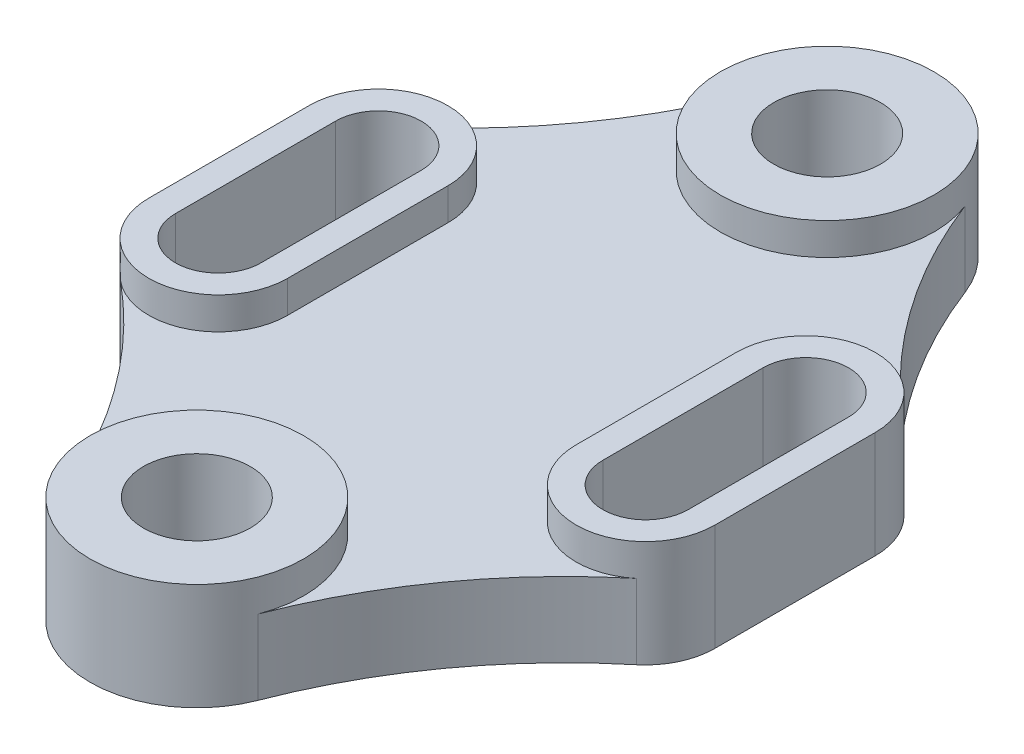
ISO-10303-21;
HEADER;
FILE_DESCRIPTION(('STEP AP214'),'2;1');
FILE_NAME('part.step','',(''),(''),'','','');
FILE_SCHEMA(('AUTOMOTIVE_DESIGN { 1 0 10303 214 1 1 1 1 }'));
ENDSEC;
DATA;
#1=APPLICATION_CONTEXT('core data for automotive mechanical design processes');
#2=APPLICATION_PROTOCOL_DEFINITION('international standard','automotive_design',2000,#1);
#3=PRODUCT_CONTEXT('',#1,'mechanical');
#4=PRODUCT('Part','Part','',(#3));
#5=PRODUCT_RELATED_PRODUCT_CATEGORY('part','',(#4));
#6=PRODUCT_DEFINITION_FORMATION('','',#4);
#7=PRODUCT_DEFINITION_CONTEXT('part definition',#1,'design');
#8=PRODUCT_DEFINITION('design','',#6,#7);
#9=PRODUCT_DEFINITION_SHAPE('','',#8);
#10=(LENGTH_UNIT() NAMED_UNIT(*) SI_UNIT(.MILLI.,.METRE.));
#11=(NAMED_UNIT(*) PLANE_ANGLE_UNIT() SI_UNIT($,.RADIAN.));
#12=(NAMED_UNIT(*) SI_UNIT($,.STERADIAN.) SOLID_ANGLE_UNIT());
#13=UNCERTAINTY_MEASURE_WITH_UNIT(LENGTH_MEASURE(1.E-05),#10,'distance_accuracy_value','');
#14=(GEOMETRIC_REPRESENTATION_CONTEXT(3) GLOBAL_UNCERTAINTY_ASSIGNED_CONTEXT((#13)) GLOBAL_UNIT_ASSIGNED_CONTEXT((#10,
#11,#12)) REPRESENTATION_CONTEXT('',''));
#15=CARTESIAN_POINT('',(0.,0.,0.));
#16=DIRECTION('',(0.,0.,1.));
#17=DIRECTION('',(1.,0.,0.));
#18=AXIS2_PLACEMENT_3D('',#15,#16,#17);
#19=CARTESIAN_POINT('',(-111.994027209244,14.,102.096842917494));
#20=DIRECTION('',(0.,-1.,0.));
#21=DIRECTION('',(0.,0.,-1.));
#22=AXIS2_PLACEMENT_3D('',#19,#20,#21);
#23=CYLINDRICAL_SURFACE('',#22,100.);
#24=CARTESIAN_POINT('',(-111.994027209244,0.,102.096842917494));
#25=DIRECTION('',(0.,1.,0.));
#26=DIRECTION('',(0.,0.,1.));
#27=AXIS2_PLACEMENT_3D('',#24,#25,#26);
#28=CIRCLE('',#27,100.);
#29=CARTESIAN_POINT('',(-18.6656712015406,0.,66.1828071529157));
#30=VERTEX_POINT('',#29);
#31=CARTESIAN_POINT('',(-48.2824987054882,0.,25.0199907781188));
#32=VERTEX_POINT('',#31);
#33=EDGE_CURVE('E179',#30,#32,#28,.T.);
#34=ORIENTED_EDGE('',*,*,#33,.F.);
#35=DIRECTION('',(0.,-1.,0.));
#36=VECTOR('',#35,1.);
#37=CARTESIAN_POINT('',(-18.6656712015406,14.,66.1828071529157));
#38=LINE('',#37,#36);
#39=CARTESIAN_POINT('',(-18.6656712015406,14.,66.1828071529157));
#40=VERTEX_POINT('',#39);
#41=EDGE_CURVE('E11',#40,#30,#38,.T.);
#42=ORIENTED_EDGE('',*,*,#41,.F.);
#43=CARTESIAN_POINT('',(-111.994027209244,14.,102.096842917494));
#44=DIRECTION('',(0.,1.,0.));
#45=DIRECTION('',(0.,0.,1.));
#46=AXIS2_PLACEMENT_3D('',#43,#44,#45);
#47=CIRCLE('',#46,100.);
#48=CARTESIAN_POINT('',(-48.2824987054882,14.,25.0199907781188));
#49=VERTEX_POINT('',#48);
#50=EDGE_CURVE('E104',#40,#49,#47,.T.);
#51=ORIENTED_EDGE('',*,*,#50,.T.);
#52=DIRECTION('',(0.,-1.,0.));
#53=VECTOR('',#52,1.);
#54=CARTESIAN_POINT('',(-48.2824987054882,14.,25.0199907781188));
#55=LINE('',#54,#53);
#56=EDGE_CURVE('E99',#49,#32,#55,.T.);
#57=ORIENTED_EDGE('',*,*,#56,.T.);
#58=EDGE_LOOP('',(#34,#42,#51,#57));
#59=FACE_BOUND('',#58,.T.);
#60=ADVANCED_FACE('F33',(#59),#23,.F.);
#61=CARTESIAN_POINT('',(111.994027209244,14.,102.096842917494));
#62=DIRECTION('',(0.,-1.,0.));
#63=DIRECTION('',(0.,0.,-1.));
#64=AXIS2_PLACEMENT_3D('',#61,#62,#63);
#65=CYLINDRICAL_SURFACE('',#64,100.);
#66=CARTESIAN_POINT('',(111.994027209244,0.,102.096842917494));
#67=DIRECTION('',(0.,1.,0.));
#68=DIRECTION('',(0.,0.,1.));
#69=AXIS2_PLACEMENT_3D('',#66,#67,#68);
#70=CIRCLE('',#69,100.);
#71=CARTESIAN_POINT('',(18.6656712015406,0.,66.1828071529157));
#72=VERTEX_POINT('',#71);
#73=CARTESIAN_POINT('',(48.2824987054882,0.,25.0199907781188));
#74=VERTEX_POINT('',#73);
#75=EDGE_CURVE('E109',#72,#74,#70,.F.);
#76=ORIENTED_EDGE('',*,*,#75,.T.);
#77=DIRECTION('',(0.,-1.,0.));
#78=VECTOR('',#77,1.);
#79=CARTESIAN_POINT('',(48.2824987054882,14.,25.0199907781188));
#80=LINE('',#79,#78);
#81=CARTESIAN_POINT('',(48.2824987054882,14.,25.0199907781188));
#82=VERTEX_POINT('',#81);
#83=EDGE_CURVE('E122',#82,#74,#80,.T.);
#84=ORIENTED_EDGE('',*,*,#83,.F.);
#85=CARTESIAN_POINT('',(111.994027209244,14.,102.096842917494));
#86=DIRECTION('',(0.,1.,0.));
#87=DIRECTION('',(0.,0.,1.));
#88=AXIS2_PLACEMENT_3D('',#85,#86,#87);
#89=CIRCLE('',#88,100.);
#90=CARTESIAN_POINT('',(18.6656712015406,14.,66.1828071529157));
#91=VERTEX_POINT('',#90);
#92=EDGE_CURVE('E133',#91,#82,#89,.F.);
#93=ORIENTED_EDGE('',*,*,#92,.F.);
#94=DIRECTION('',(0.,-1.,0.));
#95=VECTOR('',#94,1.);
#96=CARTESIAN_POINT('',(18.6656712015406,14.,66.1828071529157));
#97=LINE('',#96,#95);
#98=EDGE_CURVE('E41',#91,#72,#97,.T.);
#99=ORIENTED_EDGE('',*,*,#98,.T.);
#100=EDGE_LOOP('',(#76,#84,#93,#99));
#101=FACE_BOUND('',#100,.T.);
#102=ADVANCED_FACE('F129',(#101),#65,.F.);
#103=CARTESIAN_POINT('',(111.994027209244,14.,-102.096842917494));
#104=DIRECTION('',(0.,-1.,0.));
#105=DIRECTION('',(0.,0.,-1.));
#106=AXIS2_PLACEMENT_3D('',#103,#104,#105);
#107=CYLINDRICAL_SURFACE('',#106,100.);
#108=CARTESIAN_POINT('',(111.994027209244,0.,-102.096842917494));
#109=DIRECTION('',(0.,1.,0.));
#110=DIRECTION('',(0.,0.,1.));
#111=AXIS2_PLACEMENT_3D('',#108,#109,#110);
#112=CIRCLE('',#111,100.);
#113=CARTESIAN_POINT('',(18.6656712015406,0.,-66.1828071529157));
#114=VERTEX_POINT('',#113);
#115=CARTESIAN_POINT('',(48.2824987054882,0.,-25.0199907781188));
#116=VERTEX_POINT('',#115);
#117=EDGE_CURVE('E105',#114,#116,#112,.T.);
#118=ORIENTED_EDGE('',*,*,#117,.F.);
#119=DIRECTION('',(0.,-1.,0.));
#120=VECTOR('',#119,1.);
#121=CARTESIAN_POINT('',(18.6656712015406,14.,-66.1828071529157));
#122=LINE('',#121,#120);
#123=CARTESIAN_POINT('',(18.6656712015406,14.,-66.1828071529157));
#124=VERTEX_POINT('',#123);
#125=EDGE_CURVE('E117',#124,#114,#122,.T.);
#126=ORIENTED_EDGE('',*,*,#125,.F.);
#127=CARTESIAN_POINT('',(111.994027209244,14.,-102.096842917494));
#128=DIRECTION('',(0.,1.,0.));
#129=DIRECTION('',(0.,0.,1.));
#130=AXIS2_PLACEMENT_3D('',#127,#128,#129);
#131=CIRCLE('',#130,100.);
#132=CARTESIAN_POINT('',(48.2824987054882,14.,-25.0199907781188));
#133=VERTEX_POINT('',#132);
#134=EDGE_CURVE('E165',#124,#133,#131,.T.);
#135=ORIENTED_EDGE('',*,*,#134,.T.);
#136=DIRECTION('',(0.,-1.,0.));
#137=VECTOR('',#136,1.);
#138=CARTESIAN_POINT('',(48.2824987054882,14.,-25.0199907781188));
#139=LINE('',#138,#137);
#140=EDGE_CURVE('E119',#133,#116,#139,.T.);
#141=ORIENTED_EDGE('',*,*,#140,.T.);
#142=EDGE_LOOP('',(#118,#126,#135,#141));
#143=FACE_BOUND('',#142,.T.);
#144=ADVANCED_FACE('F345',(#143),#107,.F.);
#145=CARTESIAN_POINT('',(-111.994027209244,14.,-102.096842917494));
#146=DIRECTION('',(0.,-1.,0.));
#147=DIRECTION('',(0.,0.,-1.));
#148=AXIS2_PLACEMENT_3D('',#145,#146,#147);
#149=CYLINDRICAL_SURFACE('',#148,100.);
#150=CARTESIAN_POINT('',(-111.994027209244,0.,-102.096842917494));
#151=DIRECTION('',(0.,1.,0.));
#152=DIRECTION('',(0.,0.,1.));
#153=AXIS2_PLACEMENT_3D('',#150,#151,#152);
#154=CIRCLE('',#153,100.);
#155=CARTESIAN_POINT('',(-18.6656712015406,0.,-66.1828071529157));
#156=VERTEX_POINT('',#155);
#157=CARTESIAN_POINT('',(-48.2824987054882,0.,-25.0199907781188));
#158=VERTEX_POINT('',#157);
#159=EDGE_CURVE('E76',#156,#158,#154,.F.);
#160=ORIENTED_EDGE('',*,*,#159,.T.);
#161=DIRECTION('',(0.,-1.,0.));
#162=VECTOR('',#161,1.);
#163=CARTESIAN_POINT('',(-48.2824987054882,14.,-25.0199907781188));
#164=LINE('',#163,#162);
#165=CARTESIAN_POINT('',(-48.2824987054882,14.,-25.0199907781188));
#166=VERTEX_POINT('',#165);
#167=EDGE_CURVE('E89',#166,#158,#164,.T.);
#168=ORIENTED_EDGE('',*,*,#167,.F.);
#169=CARTESIAN_POINT('',(-111.994027209244,14.,-102.096842917494));
#170=DIRECTION('',(0.,1.,0.));
#171=DIRECTION('',(0.,0.,1.));
#172=AXIS2_PLACEMENT_3D('',#169,#170,#171);
#173=CIRCLE('',#172,100.);
#174=CARTESIAN_POINT('',(-18.6656712015406,14.,-66.1828071529157));
#175=VERTEX_POINT('',#174);
#176=EDGE_CURVE('E171',#175,#166,#173,.F.);
#177=ORIENTED_EDGE('',*,*,#176,.F.);
#178=DIRECTION('',(0.,-1.,0.));
#179=VECTOR('',#178,1.);
#180=CARTESIAN_POINT('',(-18.6656712015406,14.,-66.1828071529157));
#181=LINE('',#180,#179);
#182=EDGE_CURVE('E98',#175,#156,#181,.T.);
#183=ORIENTED_EDGE('',*,*,#182,.T.);
#184=EDGE_LOOP('',(#160,#168,#177,#183));
#185=FACE_BOUND('',#184,.T.);
#186=ADVANCED_FACE('F102',(#185),#149,.F.);
#187=CARTESIAN_POINT('',(0.,14.,0.));
#188=DIRECTION('',(0.,1.,0.));
#189=DIRECTION('',(0.,0.,1.));
#190=AXIS2_PLACEMENT_3D('',#187,#188,#189);
#191=PLANE('',#190);
#192=ORIENTED_EDGE('',*,*,#50,.F.);
#193=CARTESIAN_POINT('',(0.,14.,59.));
#194=DIRECTION('',(0.,1.,0.));
#195=DIRECTION('',(0.,0.,1.));
#196=AXIS2_PLACEMENT_3D('',#193,#194,#195);
#197=CIRCLE('',#196,20.);
#198=EDGE_CURVE('E49',#40,#91,#197,.F.);
#199=ORIENTED_EDGE('',*,*,#198,.T.);
#200=ORIENTED_EDGE('',*,*,#92,.T.);
#201=CARTESIAN_POINT('',(40.,14.,15.));
#202=DIRECTION('',(0.,1.,0.));
#203=DIRECTION('',(0.,0.,1.));
#204=AXIS2_PLACEMENT_3D('',#201,#202,#203);
#205=CIRCLE('',#204,13.);
#206=CARTESIAN_POINT('',(27.,14.,15.));
#207=VERTEX_POINT('',#206);
#208=EDGE_CURVE('E156',#207,#82,#205,.T.);
#209=ORIENTED_EDGE('',*,*,#208,.F.);
#210=DIRECTION('',(0.,0.,-1.));
#211=VECTOR('',#210,1.);
#212=CARTESIAN_POINT('',(27.,14.,0.));
#213=LINE('',#212,#211);
#214=CARTESIAN_POINT('',(27.,14.,-15.));
#215=VERTEX_POINT('',#214);
#216=EDGE_CURVE('E159',#207,#215,#213,.T.);
#217=ORIENTED_EDGE('',*,*,#216,.T.);
#218=CARTESIAN_POINT('',(40.,14.,-15.));
#219=DIRECTION('',(0.,1.,0.));
#220=DIRECTION('',(0.,0.,1.));
#221=AXIS2_PLACEMENT_3D('',#218,#219,#220);
#222=CIRCLE('',#221,13.);
#223=EDGE_CURVE('E162',#133,#215,#222,.T.);
#224=ORIENTED_EDGE('',*,*,#223,.F.);
#225=ORIENTED_EDGE('',*,*,#134,.F.);
#226=CARTESIAN_POINT('',(0.,14.,-59.));
#227=DIRECTION('',(0.,1.,0.));
#228=DIRECTION('',(0.,0.,1.));
#229=AXIS2_PLACEMENT_3D('',#226,#227,#228);
#230=CIRCLE('',#229,20.);
#231=EDGE_CURVE('E168',#175,#124,#230,.T.);
#232=ORIENTED_EDGE('',*,*,#231,.F.);
#233=ORIENTED_EDGE('',*,*,#176,.T.);
#234=CARTESIAN_POINT('',(-40.,14.,-15.));
#235=DIRECTION('',(0.,1.,0.));
#236=DIRECTION('',(0.,0.,1.));
#237=AXIS2_PLACEMENT_3D('',#234,#235,#236);
#238=CIRCLE('',#237,13.);
#239=CARTESIAN_POINT('',(-27.,14.,-15.));
#240=VERTEX_POINT('',#239);
#241=EDGE_CURVE('E94',#240,#166,#238,.T.);
#242=ORIENTED_EDGE('',*,*,#241,.F.);
#243=DIRECTION('',(0.,0.,-1.));
#244=VECTOR('',#243,1.);
#245=CARTESIAN_POINT('',(-27.,14.,0.));
#246=LINE('',#245,#244);
#247=CARTESIAN_POINT('',(-27.,14.,15.));
#248=VERTEX_POINT('',#247);
#249=EDGE_CURVE('E174',#248,#240,#246,.T.);
#250=ORIENTED_EDGE('',*,*,#249,.F.);
#251=CARTESIAN_POINT('',(-40.,14.,15.));
#252=DIRECTION('',(0.,1.,0.));
#253=DIRECTION('',(0.,0.,1.));
#254=AXIS2_PLACEMENT_3D('',#251,#252,#253);
#255=CIRCLE('',#254,13.);
#256=EDGE_CURVE('E114',#49,#248,#255,.T.);
#257=ORIENTED_EDGE('',*,*,#256,.F.);
#258=EDGE_LOOP('',(#192,#199,#200,#209,#217,#224,#225,#232,#233,#242,#250,#257));
#259=FACE_BOUND('',#258,.T.);
#260=ADVANCED_FACE('F348',(#259),#191,.T.);
#261=CARTESIAN_POINT('',(0.,0.,0.));
#262=DIRECTION('',(0.,1.,0.));
#263=DIRECTION('',(0.,0.,1.));
#264=AXIS2_PLACEMENT_3D('',#261,#262,#263);
#265=PLANE('',#264);
#266=CARTESIAN_POINT('',(40.,0.,15.));
#267=DIRECTION('',(0.,1.,0.));
#268=DIRECTION('',(0.,0.,1.));
#269=AXIS2_PLACEMENT_3D('',#266,#267,#268);
#270=CIRCLE('',#269,13.);
#271=CARTESIAN_POINT('',(53.,0.,15.));
#272=VERTEX_POINT('',#271);
#273=EDGE_CURVE('E275',#74,#272,#270,.T.);
#274=ORIENTED_EDGE('',*,*,#273,.F.);
#275=ORIENTED_EDGE('',*,*,#75,.F.);
#276=CARTESIAN_POINT('',(0.,0.,59.));
#277=DIRECTION('',(0.,1.,0.));
#278=DIRECTION('',(0.,0.,1.));
#279=AXIS2_PLACEMENT_3D('',#276,#277,#278);
#280=CIRCLE('',#279,20.);
#281=EDGE_CURVE('E137',#72,#30,#280,.F.);
#282=ORIENTED_EDGE('',*,*,#281,.T.);
#283=ORIENTED_EDGE('',*,*,#33,.T.);
#284=CARTESIAN_POINT('',(-40.,0.,15.));
#285=DIRECTION('',(0.,1.,0.));
#286=DIRECTION('',(0.,0.,1.));
#287=AXIS2_PLACEMENT_3D('',#284,#285,#286);
#288=CIRCLE('',#287,13.);
#289=CARTESIAN_POINT('',(-53.,0.,15.));
#290=VERTEX_POINT('',#289);
#291=EDGE_CURVE('E85',#290,#32,#288,.T.);
#292=ORIENTED_EDGE('',*,*,#291,.F.);
#293=DIRECTION('',(0.,0.,-1.));
#294=VECTOR('',#293,1.);
#295=CARTESIAN_POINT('',(-53.,0.,0.));
#296=LINE('',#295,#294);
#297=CARTESIAN_POINT('',(-53.,0.,-15.));
#298=VERTEX_POINT('',#297);
#299=EDGE_CURVE('E80',#290,#298,#296,.T.);
#300=ORIENTED_EDGE('',*,*,#299,.T.);
#301=CARTESIAN_POINT('',(-40.,0.,-15.));
#302=DIRECTION('',(0.,1.,0.));
#303=DIRECTION('',(0.,0.,1.));
#304=AXIS2_PLACEMENT_3D('',#301,#302,#303);
#305=CIRCLE('',#304,13.);
#306=EDGE_CURVE('E69',#158,#298,#305,.T.);
#307=ORIENTED_EDGE('',*,*,#306,.F.);
#308=ORIENTED_EDGE('',*,*,#159,.F.);
#309=CARTESIAN_POINT('',(0.,0.,-59.));
#310=DIRECTION('',(0.,1.,0.));
#311=DIRECTION('',(0.,0.,1.));
#312=AXIS2_PLACEMENT_3D('',#309,#310,#311);
#313=CIRCLE('',#312,20.);
#314=EDGE_CURVE('E64',#114,#156,#313,.T.);
#315=ORIENTED_EDGE('',*,*,#314,.F.);
#316=ORIENTED_EDGE('',*,*,#117,.T.);
#317=CARTESIAN_POINT('',(40.,0.,-15.));
#318=DIRECTION('',(0.,1.,0.));
#319=DIRECTION('',(0.,0.,1.));
#320=AXIS2_PLACEMENT_3D('',#317,#318,#319);
#321=CIRCLE('',#320,13.);
#322=CARTESIAN_POINT('',(53.,0.,-15.));
#323=VERTEX_POINT('',#322);
#324=EDGE_CURVE('E268',#323,#116,#321,.T.);
#325=ORIENTED_EDGE('',*,*,#324,.F.);
#326=DIRECTION('',(0.,0.,-1.));
#327=VECTOR('',#326,1.);
#328=CARTESIAN_POINT('',(53.,0.,0.));
#329=LINE('',#328,#327);
#330=EDGE_CURVE('E272',#272,#323,#329,.T.);
#331=ORIENTED_EDGE('',*,*,#330,.F.);
#332=EDGE_LOOP('',(#274,#275,#282,#283,#292,#300,#307,#308,#315,#316,#325,#331));
#333=FACE_BOUND('',#332,.T.);
#334=CARTESIAN_POINT('',(0.,0.,59.));
#335=DIRECTION('',(0.,1.,0.));
#336=DIRECTION('',(0.,0.,1.));
#337=AXIS2_PLACEMENT_3D('',#334,#335,#336);
#338=CIRCLE('',#337,10.);
#339=CARTESIAN_POINT('',(0.,0.,69.));
#340=VERTEX_POINT('',#339);
#341=EDGE_CURVE('E141',#340,#340,#338,.F.);
#342=ORIENTED_EDGE('',*,*,#341,.F.);
#343=EDGE_LOOP('',(#342));
#344=FACE_BOUND('',#343,.T.);
#345=CARTESIAN_POINT('',(-40.,0.,-15.));
#346=DIRECTION('',(0.,1.,0.));
#347=DIRECTION('',(0.,0.,1.));
#348=AXIS2_PLACEMENT_3D('',#345,#346,#347);
#349=CIRCLE('',#348,7.99999999999999);
#350=CARTESIAN_POINT('',(-32.,0.,-15.));
#351=VERTEX_POINT('',#350);
#352=CARTESIAN_POINT('',(-48.,0.,-15.));
#353=VERTEX_POINT('',#352);
#354=EDGE_CURVE('E218',#351,#353,#349,.T.);
#355=ORIENTED_EDGE('',*,*,#354,.T.);
#356=DIRECTION('',(0.,0.,-1.));
#357=VECTOR('',#356,1.);
#358=CARTESIAN_POINT('',(-48.,0.,0.));
#359=LINE('',#358,#357);
#360=CARTESIAN_POINT('',(-48.,0.,15.));
#361=VERTEX_POINT('',#360);
#362=EDGE_CURVE('E209',#361,#353,#359,.T.);
#363=ORIENTED_EDGE('',*,*,#362,.F.);
#364=CARTESIAN_POINT('',(-40.,0.,15.));
#365=DIRECTION('',(0.,1.,0.));
#366=DIRECTION('',(0.,0.,1.));
#367=AXIS2_PLACEMENT_3D('',#364,#365,#366);
#368=CIRCLE('',#367,7.99999999999999);
#369=CARTESIAN_POINT('',(-32.,0.,15.));
#370=VERTEX_POINT('',#369);
#371=EDGE_CURVE('E212',#361,#370,#368,.T.);
#372=ORIENTED_EDGE('',*,*,#371,.T.);
#373=DIRECTION('',(0.,0.,-1.));
#374=VECTOR('',#373,1.);
#375=CARTESIAN_POINT('',(-32.,0.,0.));
#376=LINE('',#375,#374);
#377=EDGE_CURVE('E215',#370,#351,#376,.T.);
#378=ORIENTED_EDGE('',*,*,#377,.T.);
#379=EDGE_LOOP('',(#355,#363,#372,#378));
#380=FACE_BOUND('',#379,.T.);
#381=CARTESIAN_POINT('',(40.,0.,-15.));
#382=DIRECTION('',(0.,1.,0.));
#383=DIRECTION('',(0.,0.,1.));
#384=AXIS2_PLACEMENT_3D('',#381,#382,#383);
#385=CIRCLE('',#384,8.);
#386=CARTESIAN_POINT('',(48.,0.,-15.));
#387=VERTEX_POINT('',#386);
#388=CARTESIAN_POINT('',(32.,0.,-15.));
#389=VERTEX_POINT('',#388);
#390=EDGE_CURVE('E287',#387,#389,#385,.T.);
#391=ORIENTED_EDGE('',*,*,#390,.T.);
#392=DIRECTION('',(0.,0.,-1.));
#393=VECTOR('',#392,1.);
#394=CARTESIAN_POINT('',(32.,0.,0.));
#395=LINE('',#394,#393);
#396=CARTESIAN_POINT('',(32.,0.,15.));
#397=VERTEX_POINT('',#396);
#398=EDGE_CURVE('E278',#397,#389,#395,.T.);
#399=ORIENTED_EDGE('',*,*,#398,.F.);
#400=CARTESIAN_POINT('',(40.,0.,15.));
#401=DIRECTION('',(0.,1.,0.));
#402=DIRECTION('',(0.,0.,1.));
#403=AXIS2_PLACEMENT_3D('',#400,#401,#402);
#404=CIRCLE('',#403,8.);
#405=CARTESIAN_POINT('',(48.,0.,15.));
#406=VERTEX_POINT('',#405);
#407=EDGE_CURVE('E281',#397,#406,#404,.T.);
#408=ORIENTED_EDGE('',*,*,#407,.T.);
#409=DIRECTION('',(0.,0.,-1.));
#410=VECTOR('',#409,1.);
#411=CARTESIAN_POINT('',(48.,0.,0.));
#412=LINE('',#411,#410);
#413=EDGE_CURVE('E284',#406,#387,#412,.T.);
#414=ORIENTED_EDGE('',*,*,#413,.T.);
#415=EDGE_LOOP('',(#391,#399,#408,#414));
#416=FACE_BOUND('',#415,.T.);
#417=CARTESIAN_POINT('',(0.,0.,-59.));
#418=DIRECTION('',(0.,1.,0.));
#419=DIRECTION('',(0.,0.,1.));
#420=AXIS2_PLACEMENT_3D('',#417,#418,#419);
#421=CIRCLE('',#420,10.);
#422=CARTESIAN_POINT('',(0.,0.,-49.));
#423=VERTEX_POINT('',#422);
#424=EDGE_CURVE('E315',#423,#423,#421,.T.);
#425=ORIENTED_EDGE('',*,*,#424,.T.);
#426=EDGE_LOOP('',(#425));
#427=FACE_BOUND('',#426,.T.);
#428=ADVANCED_FACE('F72',(#333,#344,#380,#416,#427),#265,.F.);
#429=CARTESIAN_POINT('',(0.,20.,59.));
#430=DIRECTION('',(0.,-1.,0.));
#431=DIRECTION('',(0.,0.,-1.));
#432=AXIS2_PLACEMENT_3D('',#429,#430,#431);
#433=CYLINDRICAL_SURFACE('',#432,20.);
#434=ORIENTED_EDGE('',*,*,#198,.F.);
#435=ORIENTED_EDGE('',*,*,#41,.T.);
#436=ORIENTED_EDGE('',*,*,#281,.F.);
#437=ORIENTED_EDGE('',*,*,#98,.F.);
#438=EDGE_LOOP('',(#434,#435,#436,#437));
#439=FACE_BOUND('',#438,.T.);
#440=CARTESIAN_POINT('',(0.,20.,59.));
#441=DIRECTION('',(0.,1.,0.));
#442=DIRECTION('',(0.,0.,1.));
#443=AXIS2_PLACEMENT_3D('',#440,#441,#442);
#444=CIRCLE('',#443,20.);
#445=CARTESIAN_POINT('',(0.,20.,79.));
#446=VERTEX_POINT('',#445);
#447=EDGE_CURVE('E145',#446,#446,#444,.F.);
#448=ORIENTED_EDGE('',*,*,#447,.T.);
#449=EDGE_LOOP('',(#448));
#450=FACE_BOUND('',#449,.T.);
#451=ADVANCED_FACE('F138',(#439,#450),#433,.T.);
#452=CARTESIAN_POINT('',(0.,20.,59.));
#453=DIRECTION('',(0.,-1.,0.));
#454=DIRECTION('',(0.,0.,-1.));
#455=AXIS2_PLACEMENT_3D('',#452,#453,#454);
#456=CYLINDRICAL_SURFACE('',#455,10.);
#457=CARTESIAN_POINT('',(0.,20.,59.));
#458=DIRECTION('',(0.,1.,0.));
#459=DIRECTION('',(0.,0.,1.));
#460=AXIS2_PLACEMENT_3D('',#457,#458,#459);
#461=CIRCLE('',#460,10.);
#462=CARTESIAN_POINT('',(0.,20.,69.));
#463=VERTEX_POINT('',#462);
#464=EDGE_CURVE('E151',#463,#463,#461,.F.);
#465=ORIENTED_EDGE('',*,*,#464,.F.);
#466=EDGE_LOOP('',(#465));
#467=FACE_BOUND('',#466,.T.);
#468=ORIENTED_EDGE('',*,*,#341,.T.);
#469=EDGE_LOOP('',(#468));
#470=FACE_BOUND('',#469,.T.);
#471=ADVANCED_FACE('F483',(#467,#470),#456,.F.);
#472=CARTESIAN_POINT('',(0.,20.,0.));
#473=DIRECTION('',(0.,1.,0.));
#474=DIRECTION('',(0.,0.,1.));
#475=AXIS2_PLACEMENT_3D('',#472,#473,#474);
#476=PLANE('',#475);
#477=ORIENTED_EDGE('',*,*,#447,.F.);
#478=EDGE_LOOP('',(#477));
#479=FACE_BOUND('',#478,.T.);
#480=ORIENTED_EDGE('',*,*,#464,.T.);
#481=EDGE_LOOP('',(#480));
#482=FACE_BOUND('',#481,.T.);
#483=ADVANCED_FACE('F463',(#479,#482),#476,.T.);
#484=CARTESIAN_POINT('',(-40.,20.,-15.));
#485=DIRECTION('',(0.,-1.,0.));
#486=DIRECTION('',(0.,0.,-1.));
#487=AXIS2_PLACEMENT_3D('',#484,#485,#486);
#488=CYLINDRICAL_SURFACE('',#487,13.);
#489=ORIENTED_EDGE('',*,*,#241,.T.);
#490=ORIENTED_EDGE('',*,*,#167,.T.);
#491=ORIENTED_EDGE('',*,*,#306,.T.);
#492=DIRECTION('',(0.,-1.,0.));
#493=VECTOR('',#492,1.);
#494=CARTESIAN_POINT('',(-53.,20.,-15.));
#495=LINE('',#494,#493);
#496=CARTESIAN_POINT('',(-53.,20.,-15.));
#497=VERTEX_POINT('',#496);
#498=EDGE_CURVE('E190',#497,#298,#495,.T.);
#499=ORIENTED_EDGE('',*,*,#498,.F.);
#500=CARTESIAN_POINT('',(-40.,20.,-15.));
#501=DIRECTION('',(0.,1.,0.));
#502=DIRECTION('',(0.,0.,1.));
#503=AXIS2_PLACEMENT_3D('',#500,#501,#502);
#504=CIRCLE('',#503,13.);
#505=CARTESIAN_POINT('',(-27.,20.,-15.));
#506=VERTEX_POINT('',#505);
#507=EDGE_CURVE('E199',#506,#497,#504,.T.);
#508=ORIENTED_EDGE('',*,*,#507,.F.);
#509=DIRECTION('',(0.,-1.,0.));
#510=VECTOR('',#509,1.);
#511=CARTESIAN_POINT('',(-27.,20.,-15.));
#512=LINE('',#511,#510);
#513=EDGE_CURVE('E203',#506,#240,#512,.T.);
#514=ORIENTED_EDGE('',*,*,#513,.T.);
#515=EDGE_LOOP('',(#489,#490,#491,#499,#508,#514));
#516=FACE_BOUND('',#515,.T.);
#517=ADVANCED_FACE('F90',(#516),#488,.T.);
#518=CARTESIAN_POINT('',(-53.,20.,0.));
#519=DIRECTION('',(-1.,0.,0.));
#520=DIRECTION('',(0.,0.,1.));
#521=AXIS2_PLACEMENT_3D('',#518,#519,#520);
#522=PLANE('',#521);
#523=ORIENTED_EDGE('',*,*,#299,.F.);
#524=DIRECTION('',(0.,-1.,0.));
#525=VECTOR('',#524,1.);
#526=CARTESIAN_POINT('',(-53.,20.,15.));
#527=LINE('',#526,#525);
#528=CARTESIAN_POINT('',(-53.,20.,15.));
#529=VERTEX_POINT('',#528);
#530=EDGE_CURVE('E142',#529,#290,#527,.T.);
#531=ORIENTED_EDGE('',*,*,#530,.F.);
#532=DIRECTION('',(0.,0.,-1.));
#533=VECTOR('',#532,1.);
#534=CARTESIAN_POINT('',(-53.,20.,0.));
#535=LINE('',#534,#533);
#536=EDGE_CURVE('E230',#529,#497,#535,.T.);
#537=ORIENTED_EDGE('',*,*,#536,.T.);
#538=ORIENTED_EDGE('',*,*,#498,.T.);
#539=EDGE_LOOP('',(#523,#531,#537,#538));
#540=FACE_BOUND('',#539,.T.);
#541=ADVANCED_FACE('F455',(#540),#522,.T.);
#542=CARTESIAN_POINT('',(-40.,20.,15.));
#543=DIRECTION('',(0.,-1.,0.));
#544=DIRECTION('',(0.,0.,-1.));
#545=AXIS2_PLACEMENT_3D('',#542,#543,#544);
#546=CYLINDRICAL_SURFACE('',#545,13.);
#547=ORIENTED_EDGE('',*,*,#56,.F.);
#548=ORIENTED_EDGE('',*,*,#256,.T.);
#549=DIRECTION('',(0.,-1.,0.));
#550=VECTOR('',#549,1.);
#551=CARTESIAN_POINT('',(-27.,20.,15.));
#552=LINE('',#551,#550);
#553=CARTESIAN_POINT('',(-27.,20.,15.));
#554=VERTEX_POINT('',#553);
#555=EDGE_CURVE('E148',#554,#248,#552,.T.);
#556=ORIENTED_EDGE('',*,*,#555,.F.);
#557=CARTESIAN_POINT('',(-40.,20.,15.));
#558=DIRECTION('',(0.,1.,0.));
#559=DIRECTION('',(0.,0.,1.));
#560=AXIS2_PLACEMENT_3D('',#557,#558,#559);
#561=CIRCLE('',#560,13.);
#562=EDGE_CURVE('E227',#529,#554,#561,.T.);
#563=ORIENTED_EDGE('',*,*,#562,.F.);
#564=ORIENTED_EDGE('',*,*,#530,.T.);
#565=ORIENTED_EDGE('',*,*,#291,.T.);
#566=EDGE_LOOP('',(#547,#548,#556,#563,#564,#565));
#567=FACE_BOUND('',#566,.T.);
#568=ADVANCED_FACE('F442',(#567),#546,.T.);
#569=CARTESIAN_POINT('',(-27.,20.,0.));
#570=DIRECTION('',(-1.,0.,0.));
#571=DIRECTION('',(0.,0.,1.));
#572=AXIS2_PLACEMENT_3D('',#569,#570,#571);
#573=PLANE('',#572);
#574=ORIENTED_EDGE('',*,*,#249,.T.);
#575=ORIENTED_EDGE('',*,*,#513,.F.);
#576=DIRECTION('',(0.,0.,-1.));
#577=VECTOR('',#576,1.);
#578=CARTESIAN_POINT('',(-27.,20.,0.));
#579=LINE('',#578,#577);
#580=EDGE_CURVE('E224',#554,#506,#579,.T.);
#581=ORIENTED_EDGE('',*,*,#580,.F.);
#582=ORIENTED_EDGE('',*,*,#555,.T.);
#583=EDGE_LOOP('',(#574,#575,#581,#582));
#584=FACE_BOUND('',#583,.T.);
#585=ADVANCED_FACE('F449',(#584),#573,.F.);
#586=CARTESIAN_POINT('',(-40.,20.,-15.));
#587=DIRECTION('',(0.,-1.,0.));
#588=DIRECTION('',(0.,0.,-1.));
#589=AXIS2_PLACEMENT_3D('',#586,#587,#588);
#590=CYLINDRICAL_SURFACE('',#589,7.99999999999999);
#591=ORIENTED_EDGE('',*,*,#354,.F.);
#592=DIRECTION('',(0.,-1.,0.));
#593=VECTOR('',#592,1.);
#594=CARTESIAN_POINT('',(-32.,20.,-15.));
#595=LINE('',#594,#593);
#596=CARTESIAN_POINT('',(-32.,20.,-15.));
#597=VERTEX_POINT('',#596);
#598=EDGE_CURVE('E187',#597,#351,#595,.T.);
#599=ORIENTED_EDGE('',*,*,#598,.F.);
#600=CARTESIAN_POINT('',(-40.,20.,-15.));
#601=DIRECTION('',(0.,1.,0.));
#602=DIRECTION('',(0.,0.,1.));
#603=AXIS2_PLACEMENT_3D('',#600,#601,#602);
#604=CIRCLE('',#603,7.99999999999999);
#605=CARTESIAN_POINT('',(-48.,20.,-15.));
#606=VERTEX_POINT('',#605);
#607=EDGE_CURVE('E84',#597,#606,#604,.T.);
#608=ORIENTED_EDGE('',*,*,#607,.T.);
#609=DIRECTION('',(0.,-1.,0.));
#610=VECTOR('',#609,1.);
#611=CARTESIAN_POINT('',(-48.,20.,-15.));
#612=LINE('',#611,#610);
#613=EDGE_CURVE('E197',#606,#353,#612,.T.);
#614=ORIENTED_EDGE('',*,*,#613,.T.);
#615=EDGE_LOOP('',(#591,#599,#608,#614));
#616=FACE_BOUND('',#615,.T.);
#617=ADVANCED_FACE('F490',(#616),#590,.F.);
#618=CARTESIAN_POINT('',(-32.,20.,0.));
#619=DIRECTION('',(-1.,0.,0.));
#620=DIRECTION('',(0.,0.,1.));
#621=AXIS2_PLACEMENT_3D('',#618,#619,#620);
#622=PLANE('',#621);
#623=ORIENTED_EDGE('',*,*,#377,.F.);
#624=DIRECTION('',(0.,-1.,0.));
#625=VECTOR('',#624,1.);
#626=CARTESIAN_POINT('',(-32.,20.,15.));
#627=LINE('',#626,#625);
#628=CARTESIAN_POINT('',(-32.,20.,15.));
#629=VERTEX_POINT('',#628);
#630=EDGE_CURVE('E191',#629,#370,#627,.T.);
#631=ORIENTED_EDGE('',*,*,#630,.F.);
#632=DIRECTION('',(0.,0.,-1.));
#633=VECTOR('',#632,1.);
#634=CARTESIAN_POINT('',(-32.,20.,0.));
#635=LINE('',#634,#633);
#636=EDGE_CURVE('E239',#629,#597,#635,.T.);
#637=ORIENTED_EDGE('',*,*,#636,.T.);
#638=ORIENTED_EDGE('',*,*,#598,.T.);
#639=EDGE_LOOP('',(#623,#631,#637,#638));
#640=FACE_BOUND('',#639,.T.);
#641=ADVANCED_FACE('F493',(#640),#622,.T.);
#642=CARTESIAN_POINT('',(-40.,20.,15.));
#643=DIRECTION('',(0.,-1.,0.));
#644=DIRECTION('',(0.,0.,-1.));
#645=AXIS2_PLACEMENT_3D('',#642,#643,#644);
#646=CYLINDRICAL_SURFACE('',#645,7.99999999999999);
#647=ORIENTED_EDGE('',*,*,#371,.F.);
#648=DIRECTION('',(0.,-1.,0.));
#649=VECTOR('',#648,1.);
#650=CARTESIAN_POINT('',(-48.,20.,15.));
#651=LINE('',#650,#649);
#652=CARTESIAN_POINT('',(-48.,20.,15.));
#653=VERTEX_POINT('',#652);
#654=EDGE_CURVE('E194',#653,#361,#651,.T.);
#655=ORIENTED_EDGE('',*,*,#654,.F.);
#656=CARTESIAN_POINT('',(-40.,20.,15.));
#657=DIRECTION('',(0.,1.,0.));
#658=DIRECTION('',(0.,0.,1.));
#659=AXIS2_PLACEMENT_3D('',#656,#657,#658);
#660=CIRCLE('',#659,7.99999999999999);
#661=EDGE_CURVE('E236',#653,#629,#660,.T.);
#662=ORIENTED_EDGE('',*,*,#661,.T.);
#663=ORIENTED_EDGE('',*,*,#630,.T.);
#664=EDGE_LOOP('',(#647,#655,#662,#663));
#665=FACE_BOUND('',#664,.T.);
#666=ADVANCED_FACE('F497',(#665),#646,.F.);
#667=CARTESIAN_POINT('',(-48.,20.,0.));
#668=DIRECTION('',(-1.,0.,0.));
#669=DIRECTION('',(0.,0.,1.));
#670=AXIS2_PLACEMENT_3D('',#667,#668,#669);
#671=PLANE('',#670);
#672=ORIENTED_EDGE('',*,*,#362,.T.);
#673=ORIENTED_EDGE('',*,*,#613,.F.);
#674=DIRECTION('',(0.,0.,-1.));
#675=VECTOR('',#674,1.);
#676=CARTESIAN_POINT('',(-48.,20.,0.));
#677=LINE('',#676,#675);
#678=EDGE_CURVE('E233',#653,#606,#677,.T.);
#679=ORIENTED_EDGE('',*,*,#678,.F.);
#680=ORIENTED_EDGE('',*,*,#654,.T.);
#681=EDGE_LOOP('',(#672,#673,#679,#680));
#682=FACE_BOUND('',#681,.T.);
#683=ADVANCED_FACE('F500',(#682),#671,.F.);
#684=CARTESIAN_POINT('',(0.,20.,0.));
#685=DIRECTION('',(0.,1.,0.));
#686=DIRECTION('',(0.,0.,1.));
#687=AXIS2_PLACEMENT_3D('',#684,#685,#686);
#688=PLANE('',#687);
#689=ORIENTED_EDGE('',*,*,#607,.F.);
#690=ORIENTED_EDGE('',*,*,#636,.F.);
#691=ORIENTED_EDGE('',*,*,#661,.F.);
#692=ORIENTED_EDGE('',*,*,#678,.T.);
#693=EDGE_LOOP('',(#689,#690,#691,#692));
#694=FACE_BOUND('',#693,.T.);
#695=ORIENTED_EDGE('',*,*,#536,.F.);
#696=ORIENTED_EDGE('',*,*,#562,.T.);
#697=ORIENTED_EDGE('',*,*,#580,.T.);
#698=ORIENTED_EDGE('',*,*,#507,.T.);
#699=EDGE_LOOP('',(#695,#696,#697,#698));
#700=FACE_BOUND('',#699,.T.);
#701=ADVANCED_FACE('F452',(#694,#700),#688,.T.);
#702=CARTESIAN_POINT('',(40.,20.,15.));
#703=DIRECTION('',(0.,-1.,0.));
#704=DIRECTION('',(0.,0.,-1.));
#705=AXIS2_PLACEMENT_3D('',#702,#703,#704);
#706=CYLINDRICAL_SURFACE('',#705,13.);
#707=ORIENTED_EDGE('',*,*,#208,.T.);
#708=ORIENTED_EDGE('',*,*,#83,.T.);
#709=ORIENTED_EDGE('',*,*,#273,.T.);
#710=DIRECTION('',(0.,-1.,0.));
#711=VECTOR('',#710,1.);
#712=CARTESIAN_POINT('',(53.,20.,15.));
#713=LINE('',#712,#711);
#714=CARTESIAN_POINT('',(53.,20.,15.));
#715=VERTEX_POINT('',#714);
#716=EDGE_CURVE('E260',#715,#272,#713,.T.);
#717=ORIENTED_EDGE('',*,*,#716,.F.);
#718=CARTESIAN_POINT('',(40.,20.,15.));
#719=DIRECTION('',(0.,1.,0.));
#720=DIRECTION('',(0.,0.,1.));
#721=AXIS2_PLACEMENT_3D('',#718,#719,#720);
#722=CIRCLE('',#721,13.);
#723=CARTESIAN_POINT('',(27.,20.,15.));
#724=VERTEX_POINT('',#723);
#725=EDGE_CURVE('E296',#724,#715,#722,.T.);
#726=ORIENTED_EDGE('',*,*,#725,.F.);
#727=DIRECTION('',(0.,-1.,0.));
#728=VECTOR('',#727,1.);
#729=CARTESIAN_POINT('',(27.,20.,15.));
#730=LINE('',#729,#728);
#731=EDGE_CURVE('E221',#724,#207,#730,.T.);
#732=ORIENTED_EDGE('',*,*,#731,.T.);
#733=EDGE_LOOP('',(#707,#708,#709,#717,#726,#732));
#734=FACE_BOUND('',#733,.T.);
#735=ADVANCED_FACE('F507',(#734),#706,.T.);
#736=CARTESIAN_POINT('',(27.,20.,0.));
#737=DIRECTION('',(-1.,0.,0.));
#738=DIRECTION('',(0.,0.,1.));
#739=AXIS2_PLACEMENT_3D('',#736,#737,#738);
#740=PLANE('',#739);
#741=DIRECTION('',(0.,-1.,0.));
#742=VECTOR('',#741,1.);
#743=CARTESIAN_POINT('',(27.,20.,-15.));
#744=LINE('',#743,#742);
#745=CARTESIAN_POINT('',(27.,20.,-15.));
#746=VERTEX_POINT('',#745);
#747=EDGE_CURVE('E247',#746,#215,#744,.T.);
#748=ORIENTED_EDGE('',*,*,#747,.T.);
#749=ORIENTED_EDGE('',*,*,#216,.F.);
#750=ORIENTED_EDGE('',*,*,#731,.F.);
#751=DIRECTION('',(0.,0.,-1.));
#752=VECTOR('',#751,1.);
#753=CARTESIAN_POINT('',(27.,20.,0.));
#754=LINE('',#753,#752);
#755=EDGE_CURVE('E299',#724,#746,#754,.T.);
#756=ORIENTED_EDGE('',*,*,#755,.T.);
#757=EDGE_LOOP('',(#748,#749,#750,#756));
#758=FACE_BOUND('',#757,.T.);
#759=ADVANCED_FACE('F362',(#758),#740,.T.);
#760=CARTESIAN_POINT('',(53.,20.,0.));
#761=DIRECTION('',(-1.,0.,0.));
#762=DIRECTION('',(0.,0.,1.));
#763=AXIS2_PLACEMENT_3D('',#760,#761,#762);
#764=PLANE('',#763);
#765=ORIENTED_EDGE('',*,*,#330,.T.);
#766=DIRECTION('',(0.,-1.,0.));
#767=VECTOR('',#766,1.);
#768=CARTESIAN_POINT('',(53.,20.,-15.));
#769=LINE('',#768,#767);
#770=CARTESIAN_POINT('',(53.,20.,-15.));
#771=VERTEX_POINT('',#770);
#772=EDGE_CURVE('E263',#771,#323,#769,.T.);
#773=ORIENTED_EDGE('',*,*,#772,.F.);
#774=DIRECTION('',(0.,0.,-1.));
#775=VECTOR('',#774,1.);
#776=CARTESIAN_POINT('',(53.,20.,0.));
#777=LINE('',#776,#775);
#778=EDGE_CURVE('E293',#715,#771,#777,.T.);
#779=ORIENTED_EDGE('',*,*,#778,.F.);
#780=ORIENTED_EDGE('',*,*,#716,.T.);
#781=EDGE_LOOP('',(#765,#773,#779,#780));
#782=FACE_BOUND('',#781,.T.);
#783=ADVANCED_FACE('F536',(#782),#764,.F.);
#784=CARTESIAN_POINT('',(40.,20.,-15.));
#785=DIRECTION('',(0.,-1.,0.));
#786=DIRECTION('',(0.,0.,-1.));
#787=AXIS2_PLACEMENT_3D('',#784,#785,#786);
#788=CYLINDRICAL_SURFACE('',#787,8.);
#789=ORIENTED_EDGE('',*,*,#390,.F.);
#790=DIRECTION('',(0.,-1.,0.));
#791=VECTOR('',#790,1.);
#792=CARTESIAN_POINT('',(48.,20.,-15.));
#793=LINE('',#792,#791);
#794=CARTESIAN_POINT('',(48.,20.,-15.));
#795=VERTEX_POINT('',#794);
#796=EDGE_CURVE('E244',#795,#387,#793,.T.);
#797=ORIENTED_EDGE('',*,*,#796,.F.);
#798=CARTESIAN_POINT('',(40.,20.,-15.));
#799=DIRECTION('',(0.,1.,0.));
#800=DIRECTION('',(0.,0.,1.));
#801=AXIS2_PLACEMENT_3D('',#798,#799,#800);
#802=CIRCLE('',#801,8.);
#803=CARTESIAN_POINT('',(32.,20.,-15.));
#804=VERTEX_POINT('',#803);
#805=EDGE_CURVE('E271',#795,#804,#802,.T.);
#806=ORIENTED_EDGE('',*,*,#805,.T.);
#807=DIRECTION('',(0.,-1.,0.));
#808=VECTOR('',#807,1.);
#809=CARTESIAN_POINT('',(32.,20.,-15.));
#810=LINE('',#809,#808);
#811=EDGE_CURVE('E254',#804,#389,#810,.T.);
#812=ORIENTED_EDGE('',*,*,#811,.T.);
#813=EDGE_LOOP('',(#789,#797,#806,#812));
#814=FACE_BOUND('',#813,.T.);
#815=ADVANCED_FACE('F539',(#814),#788,.F.);
#816=CARTESIAN_POINT('',(48.,20.,0.));
#817=DIRECTION('',(-1.,0.,0.));
#818=DIRECTION('',(0.,0.,1.));
#819=AXIS2_PLACEMENT_3D('',#816,#817,#818);
#820=PLANE('',#819);
#821=ORIENTED_EDGE('',*,*,#413,.F.);
#822=DIRECTION('',(0.,-1.,0.));
#823=VECTOR('',#822,1.);
#824=CARTESIAN_POINT('',(48.,20.,15.));
#825=LINE('',#824,#823);
#826=CARTESIAN_POINT('',(48.,20.,15.));
#827=VERTEX_POINT('',#826);
#828=EDGE_CURVE('E248',#827,#406,#825,.T.);
#829=ORIENTED_EDGE('',*,*,#828,.F.);
#830=DIRECTION('',(0.,0.,-1.));
#831=VECTOR('',#830,1.);
#832=CARTESIAN_POINT('',(48.,20.,0.));
#833=LINE('',#832,#831);
#834=EDGE_CURVE('E308',#827,#795,#833,.T.);
#835=ORIENTED_EDGE('',*,*,#834,.T.);
#836=ORIENTED_EDGE('',*,*,#796,.T.);
#837=EDGE_LOOP('',(#821,#829,#835,#836));
#838=FACE_BOUND('',#837,.T.);
#839=ADVANCED_FACE('F552',(#838),#820,.T.);
#840=CARTESIAN_POINT('',(40.,20.,15.));
#841=DIRECTION('',(0.,-1.,0.));
#842=DIRECTION('',(0.,0.,-1.));
#843=AXIS2_PLACEMENT_3D('',#840,#841,#842);
#844=CYLINDRICAL_SURFACE('',#843,8.);
#845=ORIENTED_EDGE('',*,*,#407,.F.);
#846=DIRECTION('',(0.,-1.,0.));
#847=VECTOR('',#846,1.);
#848=CARTESIAN_POINT('',(32.,20.,15.));
#849=LINE('',#848,#847);
#850=CARTESIAN_POINT('',(32.,20.,15.));
#851=VERTEX_POINT('',#850);
#852=EDGE_CURVE('E251',#851,#397,#849,.T.);
#853=ORIENTED_EDGE('',*,*,#852,.F.);
#854=CARTESIAN_POINT('',(40.,20.,15.));
#855=DIRECTION('',(0.,1.,0.));
#856=DIRECTION('',(0.,0.,1.));
#857=AXIS2_PLACEMENT_3D('',#854,#855,#856);
#858=CIRCLE('',#857,8.);
#859=EDGE_CURVE('E305',#851,#827,#858,.T.);
#860=ORIENTED_EDGE('',*,*,#859,.T.);
#861=ORIENTED_EDGE('',*,*,#828,.T.);
#862=EDGE_LOOP('',(#845,#853,#860,#861));
#863=FACE_BOUND('',#862,.T.);
#864=ADVANCED_FACE('F548',(#863),#844,.F.);
#865=CARTESIAN_POINT('',(32.,20.,0.));
#866=DIRECTION('',(-1.,0.,0.));
#867=DIRECTION('',(0.,0.,1.));
#868=AXIS2_PLACEMENT_3D('',#865,#866,#867);
#869=PLANE('',#868);
#870=ORIENTED_EDGE('',*,*,#398,.T.);
#871=ORIENTED_EDGE('',*,*,#811,.F.);
#872=DIRECTION('',(0.,0.,-1.));
#873=VECTOR('',#872,1.);
#874=CARTESIAN_POINT('',(32.,20.,0.));
#875=LINE('',#874,#873);
#876=EDGE_CURVE('E302',#851,#804,#875,.T.);
#877=ORIENTED_EDGE('',*,*,#876,.F.);
#878=ORIENTED_EDGE('',*,*,#852,.T.);
#879=EDGE_LOOP('',(#870,#871,#877,#878));
#880=FACE_BOUND('',#879,.T.);
#881=ADVANCED_FACE('F535',(#880),#869,.F.);
#882=CARTESIAN_POINT('',(40.,20.,-15.));
#883=DIRECTION('',(0.,-1.,0.));
#884=DIRECTION('',(0.,0.,-1.));
#885=AXIS2_PLACEMENT_3D('',#882,#883,#884);
#886=CYLINDRICAL_SURFACE('',#885,13.);
#887=ORIENTED_EDGE('',*,*,#140,.F.);
#888=ORIENTED_EDGE('',*,*,#223,.T.);
#889=ORIENTED_EDGE('',*,*,#747,.F.);
#890=CARTESIAN_POINT('',(40.,20.,-15.));
#891=DIRECTION('',(0.,1.,0.));
#892=DIRECTION('',(0.,0.,1.));
#893=AXIS2_PLACEMENT_3D('',#890,#891,#892);
#894=CIRCLE('',#893,13.);
#895=EDGE_CURVE('E257',#771,#746,#894,.T.);
#896=ORIENTED_EDGE('',*,*,#895,.F.);
#897=ORIENTED_EDGE('',*,*,#772,.T.);
#898=ORIENTED_EDGE('',*,*,#324,.T.);
#899=EDGE_LOOP('',(#887,#888,#889,#896,#897,#898));
#900=FACE_BOUND('',#899,.T.);
#901=ADVANCED_FACE('F356',(#900),#886,.T.);
#902=CARTESIAN_POINT('',(0.,20.,0.));
#903=DIRECTION('',(0.,1.,0.));
#904=DIRECTION('',(0.,0.,1.));
#905=AXIS2_PLACEMENT_3D('',#902,#903,#904);
#906=PLANE('',#905);
#907=ORIENTED_EDGE('',*,*,#805,.F.);
#908=ORIENTED_EDGE('',*,*,#834,.F.);
#909=ORIENTED_EDGE('',*,*,#859,.F.);
#910=ORIENTED_EDGE('',*,*,#876,.T.);
#911=EDGE_LOOP('',(#907,#908,#909,#910));
#912=FACE_BOUND('',#911,.T.);
#913=ORIENTED_EDGE('',*,*,#755,.F.);
#914=ORIENTED_EDGE('',*,*,#725,.T.);
#915=ORIENTED_EDGE('',*,*,#778,.T.);
#916=ORIENTED_EDGE('',*,*,#895,.T.);
#917=EDGE_LOOP('',(#913,#914,#915,#916));
#918=FACE_BOUND('',#917,.T.);
#919=ADVANCED_FACE('F335',(#912,#918),#906,.T.);
#920=CARTESIAN_POINT('',(0.,20.,-59.));
#921=DIRECTION('',(0.,-1.,0.));
#922=DIRECTION('',(0.,0.,-1.));
#923=AXIS2_PLACEMENT_3D('',#920,#921,#922);
#924=CYLINDRICAL_SURFACE('',#923,20.);
#925=CARTESIAN_POINT('',(0.,20.,-59.));
#926=DIRECTION('',(0.,1.,0.));
#927=DIRECTION('',(0.,0.,1.));
#928=AXIS2_PLACEMENT_3D('',#925,#926,#927);
#929=CIRCLE('',#928,20.);
#930=CARTESIAN_POINT('',(0.,20.,-39.));
#931=VERTEX_POINT('',#930);
#932=EDGE_CURVE('E290',#931,#931,#929,.T.);
#933=ORIENTED_EDGE('',*,*,#932,.F.);
#934=EDGE_LOOP('',(#933));
#935=FACE_BOUND('',#934,.T.);
#936=ORIENTED_EDGE('',*,*,#231,.T.);
#937=ORIENTED_EDGE('',*,*,#125,.T.);
#938=ORIENTED_EDGE('',*,*,#314,.T.);
#939=ORIENTED_EDGE('',*,*,#182,.F.);
#940=EDGE_LOOP('',(#936,#937,#938,#939));
#941=FACE_BOUND('',#940,.T.);
#942=ADVANCED_FACE('F332',(#935,#941),#924,.T.);
#943=CARTESIAN_POINT('',(0.,20.,-59.));
#944=DIRECTION('',(0.,-1.,0.));
#945=DIRECTION('',(0.,0.,-1.));
#946=AXIS2_PLACEMENT_3D('',#943,#944,#945);
#947=CYLINDRICAL_SURFACE('',#946,10.);
#948=CARTESIAN_POINT('',(0.,20.,-59.));
#949=DIRECTION('',(0.,1.,0.));
#950=DIRECTION('',(0.,0.,1.));
#951=AXIS2_PLACEMENT_3D('',#948,#949,#950);
#952=CIRCLE('',#951,10.);
#953=CARTESIAN_POINT('',(0.,20.,-49.));
#954=VERTEX_POINT('',#953);
#955=EDGE_CURVE('E314',#954,#954,#952,.T.);
#956=ORIENTED_EDGE('',*,*,#955,.T.);
#957=EDGE_LOOP('',(#956));
#958=FACE_BOUND('',#957,.T.);
#959=ORIENTED_EDGE('',*,*,#424,.F.);
#960=EDGE_LOOP('',(#959));
#961=FACE_BOUND('',#960,.T.);
#962=ADVANCED_FACE('F323',(#958,#961),#947,.F.);
#963=CARTESIAN_POINT('',(0.,20.,0.));
#964=DIRECTION('',(0.,1.,0.));
#965=DIRECTION('',(0.,0.,1.));
#966=AXIS2_PLACEMENT_3D('',#963,#964,#965);
#967=PLANE('',#966);
#968=ORIENTED_EDGE('',*,*,#955,.F.);
#969=EDGE_LOOP('',(#968));
#970=FACE_BOUND('',#969,.T.);
#971=ORIENTED_EDGE('',*,*,#932,.T.);
#972=EDGE_LOOP('',(#971));
#973=FACE_BOUND('',#972,.T.);
#974=ADVANCED_FACE('F326',(#970,#973),#967,.T.);
#975=CLOSED_SHELL('',(#60,#102,#144,#186,#260,#428,#451,#471,#483,#517,#541,#568,#585,#617,#641,
#666,#683,#701,#735,#759,#783,#815,#839,#864,#881,#901,#919,#942,#962,#974));
#976=MANIFOLD_SOLID_BREP('B2',#975);
#977=ADVANCED_BREP_SHAPE_REPRESENTATION('',(#18,#976),#14);
#978=SHAPE_DEFINITION_REPRESENTATION(#9,#977);
ENDSEC;
END-ISO-10303-21;
